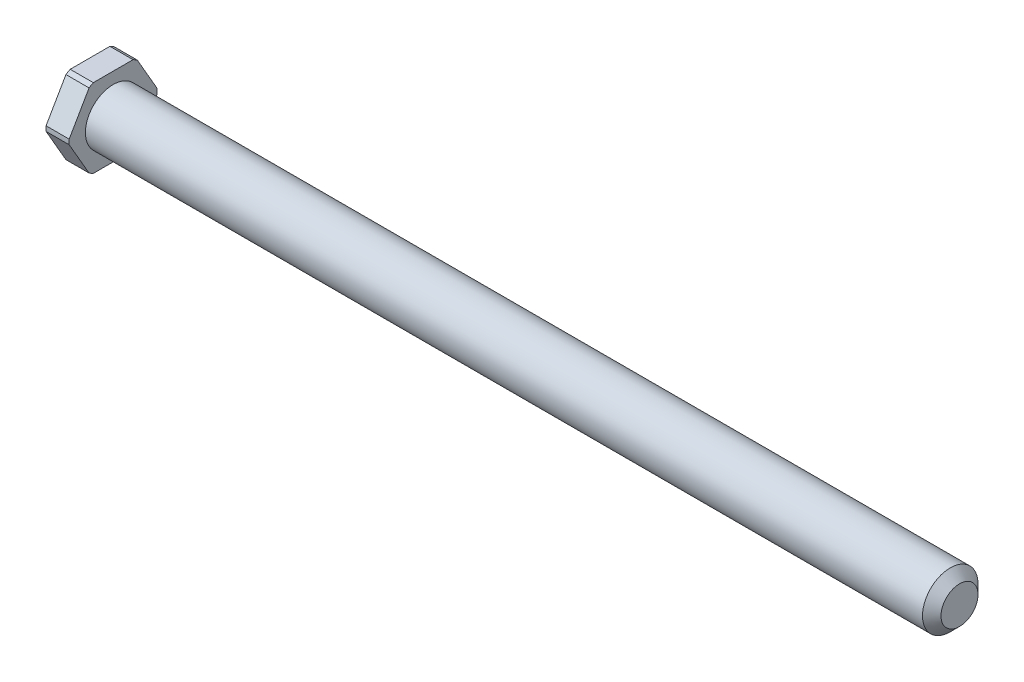
ISO-10303-21;
HEADER;
FILE_DESCRIPTION(('STEP AP214'),'2;1');
FILE_NAME('part.step','',(''),(''),'','','');
FILE_SCHEMA(('AUTOMOTIVE_DESIGN { 1 0 10303 214 1 1 1 1 }'));
ENDSEC;
DATA;
#1=APPLICATION_CONTEXT('core data for automotive mechanical design processes');
#2=APPLICATION_PROTOCOL_DEFINITION('international standard','automotive_design',2000,#1);
#3=PRODUCT_CONTEXT('',#1,'mechanical');
#4=PRODUCT('Part','Part','',(#3));
#5=PRODUCT_RELATED_PRODUCT_CATEGORY('part','',(#4));
#6=PRODUCT_DEFINITION_FORMATION('','',#4);
#7=PRODUCT_DEFINITION_CONTEXT('part definition',#1,'design');
#8=PRODUCT_DEFINITION('design','',#6,#7);
#9=PRODUCT_DEFINITION_SHAPE('','',#8);
#10=(LENGTH_UNIT() NAMED_UNIT(*) SI_UNIT(.MILLI.,.METRE.));
#11=(NAMED_UNIT(*) PLANE_ANGLE_UNIT() SI_UNIT($,.RADIAN.));
#12=(NAMED_UNIT(*) SI_UNIT($,.STERADIAN.) SOLID_ANGLE_UNIT());
#13=UNCERTAINTY_MEASURE_WITH_UNIT(LENGTH_MEASURE(1.E-05),#10,'distance_accuracy_value','');
#14=(GEOMETRIC_REPRESENTATION_CONTEXT(3) GLOBAL_UNCERTAINTY_ASSIGNED_CONTEXT((#13)) GLOBAL_UNIT_ASSIGNED_CONTEXT((#10,
#11,#12)) REPRESENTATION_CONTEXT('',''));
#15=CARTESIAN_POINT('',(0.,0.,0.));
#16=DIRECTION('',(0.,0.,1.));
#17=DIRECTION('',(1.,0.,0.));
#18=AXIS2_PLACEMENT_3D('',#15,#16,#17);
#19=CARTESIAN_POINT('',(0.,9.525,0.));
#20=DIRECTION('',(1.,0.,0.));
#21=DIRECTION('',(0.,0.,-1.));
#22=AXIS2_PLACEMENT_3D('',#19,#20,#21);
#23=PLANE('',#22);
#24=DIRECTION('',(0.,0.,-1.));
#25=VECTOR('',#24,1.);
#26=CARTESIAN_POINT('',(0.,8.5,0.));
#27=LINE('',#26,#25);
#28=CARTESIAN_POINT('',(0.,8.5,4.29832816336771));
#29=VERTEX_POINT('',#28);
#30=CARTESIAN_POINT('',(0.,8.5,-4.29832816336771));
#31=VERTEX_POINT('',#30);
#32=EDGE_CURVE('E127',#29,#31,#27,.T.);
#33=ORIENTED_EDGE('',*,*,#32,.T.);
#34=CARTESIAN_POINT('',(0.,0.,0.));
#35=DIRECTION('',(-1.,0.,0.));
#36=DIRECTION('',(0.,0.,1.));
#37=AXIS2_PLACEMENT_3D('',#34,#35,#36);
#38=CIRCLE('',#37,9.525);
#39=CARTESIAN_POINT('',(0.,7.97246138327854,-5.21205185048388));
#40=VERTEX_POINT('',#39);
#41=EDGE_CURVE('E164',#31,#40,#38,.T.);
#42=ORIENTED_EDGE('',*,*,#41,.T.);
#43=DIRECTION('',(0.,-0.866025403784439,-0.5));
#44=VECTOR('',#43,1.);
#45=CARTESIAN_POINT('',(0.,4.25,-7.36121593216773));
#46=LINE('',#45,#44);
#47=CARTESIAN_POINT('',(0.,0.527538616721467,-9.51038001385158));
#48=VERTEX_POINT('',#47);
#49=EDGE_CURVE('E189',#40,#48,#46,.T.);
#50=ORIENTED_EDGE('',*,*,#49,.T.);
#51=CARTESIAN_POINT('',(0.,-0.527538616721464,-9.51038001385158));
#52=VERTEX_POINT('',#51);
#53=EDGE_CURVE('E169',#48,#52,#38,.T.);
#54=ORIENTED_EDGE('',*,*,#53,.T.);
#55=DIRECTION('',(0.,-0.866025403784439,0.5));
#56=VECTOR('',#55,1.);
#57=CARTESIAN_POINT('',(0.,-4.25,-7.36121593216773));
#58=LINE('',#57,#56);
#59=CARTESIAN_POINT('',(0.,-7.97246138327854,-5.21205185048388));
#60=VERTEX_POINT('',#59);
#61=EDGE_CURVE('E200',#52,#60,#58,.T.);
#62=ORIENTED_EDGE('',*,*,#61,.T.);
#63=CARTESIAN_POINT('',(0.,-8.5,-4.2983281633677));
#64=VERTEX_POINT('',#63);
#65=EDGE_CURVE('E175',#60,#64,#38,.T.);
#66=ORIENTED_EDGE('',*,*,#65,.T.);
#67=DIRECTION('',(0.,0.,1.));
#68=VECTOR('',#67,1.);
#69=CARTESIAN_POINT('',(0.,-8.5,0.));
#70=LINE('',#69,#68);
#71=CARTESIAN_POINT('',(0.,-8.5,4.2983281633677));
#72=VERTEX_POINT('',#71);
#73=EDGE_CURVE('E56',#64,#72,#70,.T.);
#74=ORIENTED_EDGE('',*,*,#73,.T.);
#75=CARTESIAN_POINT('',(0.,-7.97246138327854,5.21205185048388));
#76=VERTEX_POINT('',#75);
#77=EDGE_CURVE('E172',#72,#76,#38,.T.);
#78=ORIENTED_EDGE('',*,*,#77,.T.);
#79=DIRECTION('',(0.,0.866025403784439,0.5));
#80=VECTOR('',#79,1.);
#81=CARTESIAN_POINT('',(0.,-4.25,7.36121593216773));
#82=LINE('',#81,#80);
#83=CARTESIAN_POINT('',(0.,-0.527538616721469,9.51038001385158));
#84=VERTEX_POINT('',#83);
#85=EDGE_CURVE('E48',#76,#84,#82,.T.);
#86=ORIENTED_EDGE('',*,*,#85,.T.);
#87=CARTESIAN_POINT('',(0.,0.527538616721465,9.51038001385158));
#88=VERTEX_POINT('',#87);
#89=EDGE_CURVE('E165',#84,#88,#38,.T.);
#90=ORIENTED_EDGE('',*,*,#89,.T.);
#91=DIRECTION('',(0.,0.866025403784438,-0.5));
#92=VECTOR('',#91,1.);
#93=CARTESIAN_POINT('',(0.,4.25,7.36121593216773));
#94=LINE('',#93,#92);
#95=CARTESIAN_POINT('',(0.,7.97246138327854,5.21205185048388));
#96=VERTEX_POINT('',#95);
#97=EDGE_CURVE('E181',#88,#96,#94,.T.);
#98=ORIENTED_EDGE('',*,*,#97,.T.);
#99=EDGE_CURVE('E157',#96,#29,#38,.T.);
#100=ORIENTED_EDGE('',*,*,#99,.T.);
#101=EDGE_LOOP('',(#33,#42,#50,#54,#62,#66,#74,#78,#86,#90,#98,#100));
#102=FACE_BOUND('',#101,.T.);
#103=ADVANCED_FACE('F33',(#102),#23,.F.);
#104=CARTESIAN_POINT('',(5.,9.525,0.));
#105=DIRECTION('',(-1.,0.,0.));
#106=DIRECTION('',(0.,0.,1.));
#107=AXIS2_PLACEMENT_3D('',#104,#105,#106);
#108=PLANE('',#107);
#109=CARTESIAN_POINT('',(5.,0.,0.));
#110=DIRECTION('',(-1.,0.,0.));
#111=DIRECTION('',(0.,0.,1.));
#112=AXIS2_PLACEMENT_3D('',#109,#110,#111);
#113=CIRCLE('',#112,6.);
#114=CARTESIAN_POINT('',(5.,0.,6.));
#115=VERTEX_POINT('',#114);
#116=EDGE_CURVE('E148',#115,#115,#113,.T.);
#117=ORIENTED_EDGE('',*,*,#116,.T.);
#118=EDGE_LOOP('',(#117));
#119=FACE_BOUND('',#118,.T.);
#120=DIRECTION('',(0.,0.,1.));
#121=VECTOR('',#120,1.);
#122=CARTESIAN_POINT('',(5.,8.5,0.));
#123=LINE('',#122,#121);
#124=CARTESIAN_POINT('',(5.,8.5,-4.29832816336771));
#125=VERTEX_POINT('',#124);
#126=CARTESIAN_POINT('',(5.,8.5,4.29832816336771));
#127=VERTEX_POINT('',#126);
#128=EDGE_CURVE('E124',#125,#127,#123,.T.);
#129=ORIENTED_EDGE('',*,*,#128,.T.);
#130=CARTESIAN_POINT('',(5.,0.,0.));
#131=DIRECTION('',(-1.,0.,0.));
#132=DIRECTION('',(0.,0.,1.));
#133=AXIS2_PLACEMENT_3D('',#130,#131,#132);
#134=CIRCLE('',#133,9.525);
#135=CARTESIAN_POINT('',(5.,7.97246138327854,5.21205185048388));
#136=VERTEX_POINT('',#135);
#137=EDGE_CURVE('E139',#136,#127,#134,.T.);
#138=ORIENTED_EDGE('',*,*,#137,.F.);
#139=DIRECTION('',(0.,-0.866025403784438,0.5));
#140=VECTOR('',#139,1.);
#141=CARTESIAN_POINT('',(5.,4.25,7.36121593216773));
#142=LINE('',#141,#140);
#143=CARTESIAN_POINT('',(5.,0.527538616721465,9.51038001385158));
#144=VERTEX_POINT('',#143);
#145=EDGE_CURVE('E179',#136,#144,#142,.T.);
#146=ORIENTED_EDGE('',*,*,#145,.T.);
#147=CARTESIAN_POINT('',(5.,-0.527538616721469,9.51038001385158));
#148=VERTEX_POINT('',#147);
#149=EDGE_CURVE('E150',#148,#144,#134,.T.);
#150=ORIENTED_EDGE('',*,*,#149,.F.);
#151=DIRECTION('',(0.,-0.866025403784439,-0.5));
#152=VECTOR('',#151,1.);
#153=CARTESIAN_POINT('',(5.,-4.25,7.36121593216773));
#154=LINE('',#153,#152);
#155=CARTESIAN_POINT('',(5.,-7.97246138327854,5.21205185048388));
#156=VERTEX_POINT('',#155);
#157=EDGE_CURVE('E185',#148,#156,#154,.T.);
#158=ORIENTED_EDGE('',*,*,#157,.T.);
#159=CARTESIAN_POINT('',(5.,-8.5,4.2983281633677));
#160=VERTEX_POINT('',#159);
#161=EDGE_CURVE('E156',#160,#156,#134,.T.);
#162=ORIENTED_EDGE('',*,*,#161,.F.);
#163=DIRECTION('',(0.,0.,-1.));
#164=VECTOR('',#163,1.);
#165=CARTESIAN_POINT('',(5.,-8.5,0.));
#166=LINE('',#165,#164);
#167=CARTESIAN_POINT('',(5.,-8.5,-4.2983281633677));
#168=VERTEX_POINT('',#167);
#169=EDGE_CURVE('E208',#160,#168,#166,.T.);
#170=ORIENTED_EDGE('',*,*,#169,.T.);
#171=CARTESIAN_POINT('',(5.,-7.97246138327854,-5.21205185048388));
#172=VERTEX_POINT('',#171);
#173=EDGE_CURVE('E163',#172,#168,#134,.T.);
#174=ORIENTED_EDGE('',*,*,#173,.F.);
#175=DIRECTION('',(0.,0.866025403784439,-0.5));
#176=VECTOR('',#175,1.);
#177=CARTESIAN_POINT('',(5.,-4.25,-7.36121593216773));
#178=LINE('',#177,#176);
#179=CARTESIAN_POINT('',(5.,-0.527538616721464,-9.51038001385158));
#180=VERTEX_POINT('',#179);
#181=EDGE_CURVE('E197',#172,#180,#178,.T.);
#182=ORIENTED_EDGE('',*,*,#181,.T.);
#183=CARTESIAN_POINT('',(5.,0.527538616721467,-9.51038001385158));
#184=VERTEX_POINT('',#183);
#185=EDGE_CURVE('E153',#184,#180,#134,.T.);
#186=ORIENTED_EDGE('',*,*,#185,.F.);
#187=DIRECTION('',(0.,0.866025403784439,0.5));
#188=VECTOR('',#187,1.);
#189=CARTESIAN_POINT('',(5.,4.25,-7.36121593216773));
#190=LINE('',#189,#188);
#191=CARTESIAN_POINT('',(5.,7.97246138327854,-5.21205185048388));
#192=VERTEX_POINT('',#191);
#193=EDGE_CURVE('E187',#184,#192,#190,.T.);
#194=ORIENTED_EDGE('',*,*,#193,.T.);
#195=EDGE_CURVE('E142',#125,#192,#134,.T.);
#196=ORIENTED_EDGE('',*,*,#195,.F.);
#197=EDGE_LOOP('',(#129,#138,#146,#150,#158,#162,#170,#174,#182,#186,#194,#196));
#198=FACE_BOUND('',#197,.T.);
#199=ADVANCED_FACE('F137',(#119,#198),#108,.F.);
#200=CARTESIAN_POINT('',(0.,0.,0.));
#201=DIRECTION('',(-1.,0.,0.));
#202=DIRECTION('',(0.,0.,1.));
#203=AXIS2_PLACEMENT_3D('',#200,#201,#202);
#204=CYLINDRICAL_SURFACE('',#203,9.525);
#205=DIRECTION('',(-1.,0.,0.));
#206=VECTOR('',#205,1.);
#207=CARTESIAN_POINT('',(188.001,8.5,-4.29832816336771));
#208=LINE('',#207,#206);
#209=EDGE_CURVE('E132',#125,#31,#208,.T.);
#210=ORIENTED_EDGE('',*,*,#209,.F.);
#211=ORIENTED_EDGE('',*,*,#195,.T.);
#212=DIRECTION('',(-1.,0.,0.));
#213=VECTOR('',#212,1.);
#214=CARTESIAN_POINT('',(188.001,7.97246138327854,-5.21205185048388));
#215=LINE('',#214,#213);
#216=EDGE_CURVE('E193',#192,#40,#215,.T.);
#217=ORIENTED_EDGE('',*,*,#216,.T.);
#218=ORIENTED_EDGE('',*,*,#41,.F.);
#219=EDGE_LOOP('',(#210,#211,#217,#218));
#220=FACE_BOUND('',#219,.T.);
#221=ADVANCED_FACE('F259',(#220),#204,.T.);
#222=DIRECTION('',(-1.,0.,0.));
#223=VECTOR('',#222,1.);
#224=CARTESIAN_POINT('',(188.001,8.5,4.29832816336771));
#225=LINE('',#224,#223);
#226=EDGE_CURVE('E121',#127,#29,#225,.T.);
#227=ORIENTED_EDGE('',*,*,#226,.T.);
#228=ORIENTED_EDGE('',*,*,#99,.F.);
#229=DIRECTION('',(-1.,0.,0.));
#230=VECTOR('',#229,1.);
#231=CARTESIAN_POINT('',(188.001,7.97246138327854,5.21205185048388));
#232=LINE('',#231,#230);
#233=EDGE_CURVE('E147',#136,#96,#232,.T.);
#234=ORIENTED_EDGE('',*,*,#233,.F.);
#235=ORIENTED_EDGE('',*,*,#137,.T.);
#236=EDGE_LOOP('',(#227,#228,#234,#235));
#237=FACE_BOUND('',#236,.T.);
#238=ADVANCED_FACE('F146',(#237),#204,.T.);
#239=DIRECTION('',(-1.,0.,0.));
#240=VECTOR('',#239,1.);
#241=CARTESIAN_POINT('',(188.001,0.527538616721465,9.51038001385158));
#242=LINE('',#241,#240);
#243=EDGE_CURVE('E183',#144,#88,#242,.T.);
#244=ORIENTED_EDGE('',*,*,#243,.T.);
#245=ORIENTED_EDGE('',*,*,#89,.F.);
#246=DIRECTION('',(-1.,0.,0.));
#247=VECTOR('',#246,1.);
#248=CARTESIAN_POINT('',(188.001,-0.527538616721469,9.51038001385158));
#249=LINE('',#248,#247);
#250=EDGE_CURVE('E211',#148,#84,#249,.T.);
#251=ORIENTED_EDGE('',*,*,#250,.F.);
#252=ORIENTED_EDGE('',*,*,#149,.T.);
#253=EDGE_LOOP('',(#244,#245,#251,#252));
#254=FACE_BOUND('',#253,.T.);
#255=ADVANCED_FACE('F243',(#254),#204,.T.);
#256=DIRECTION('',(-1.,0.,0.));
#257=VECTOR('',#256,1.);
#258=CARTESIAN_POINT('',(188.001,-7.97246138327854,5.21205185048388));
#259=LINE('',#258,#257);
#260=EDGE_CURVE('E219',#156,#76,#259,.T.);
#261=ORIENTED_EDGE('',*,*,#260,.T.);
#262=ORIENTED_EDGE('',*,*,#77,.F.);
#263=DIRECTION('',(-1.,0.,0.));
#264=VECTOR('',#263,1.);
#265=CARTESIAN_POINT('',(188.001,-8.5,4.2983281633677));
#266=LINE('',#265,#264);
#267=EDGE_CURVE('E201',#160,#72,#266,.T.);
#268=ORIENTED_EDGE('',*,*,#267,.F.);
#269=ORIENTED_EDGE('',*,*,#161,.T.);
#270=EDGE_LOOP('',(#261,#262,#268,#269));
#271=FACE_BOUND('',#270,.T.);
#272=ADVANCED_FACE('F222',(#271),#204,.T.);
#273=DIRECTION('',(-1.,0.,0.));
#274=VECTOR('',#273,1.);
#275=CARTESIAN_POINT('',(188.001,-8.5,-4.2983281633677));
#276=LINE('',#275,#274);
#277=EDGE_CURVE('E213',#168,#64,#276,.T.);
#278=ORIENTED_EDGE('',*,*,#277,.T.);
#279=ORIENTED_EDGE('',*,*,#65,.F.);
#280=DIRECTION('',(-1.,0.,0.));
#281=VECTOR('',#280,1.);
#282=CARTESIAN_POINT('',(188.001,-7.97246138327854,-5.21205185048388));
#283=LINE('',#282,#281);
#284=EDGE_CURVE('E190',#172,#60,#283,.T.);
#285=ORIENTED_EDGE('',*,*,#284,.F.);
#286=ORIENTED_EDGE('',*,*,#173,.T.);
#287=EDGE_LOOP('',(#278,#279,#285,#286));
#288=FACE_BOUND('',#287,.T.);
#289=ADVANCED_FACE('F240',(#288),#204,.T.);
#290=DIRECTION('',(-1.,0.,0.));
#291=VECTOR('',#290,1.);
#292=CARTESIAN_POINT('',(188.001,-0.527538616721464,-9.51038001385158));
#293=LINE('',#292,#291);
#294=EDGE_CURVE('E204',#180,#52,#293,.T.);
#295=ORIENTED_EDGE('',*,*,#294,.T.);
#296=ORIENTED_EDGE('',*,*,#53,.F.);
#297=DIRECTION('',(-1.,0.,0.));
#298=VECTOR('',#297,1.);
#299=CARTESIAN_POINT('',(188.001,0.527538616721467,-9.51038001385158));
#300=LINE('',#299,#298);
#301=EDGE_CURVE('E143',#184,#48,#300,.T.);
#302=ORIENTED_EDGE('',*,*,#301,.F.);
#303=ORIENTED_EDGE('',*,*,#185,.T.);
#304=EDGE_LOOP('',(#295,#296,#302,#303));
#305=FACE_BOUND('',#304,.T.);
#306=ADVANCED_FACE('F233',(#305),#204,.T.);
#307=CARTESIAN_POINT('',(188.,0.,0.));
#308=DIRECTION('',(-1.,0.,0.));
#309=DIRECTION('',(0.,0.,1.));
#310=AXIS2_PLACEMENT_3D('',#307,#308,#309);
#311=PLANE('',#310);
#312=CARTESIAN_POINT('',(188.,0.,0.));
#313=DIRECTION('',(-1.,0.,0.));
#314=DIRECTION('',(0.,0.,1.));
#315=AXIS2_PLACEMENT_3D('',#312,#313,#314);
#316=CIRCLE('',#315,4.00000000000003);
#317=CARTESIAN_POINT('',(188.,0.,4.00000000000003));
#318=VERTEX_POINT('',#317);
#319=EDGE_CURVE('E11',#318,#318,#316,.F.);
#320=ORIENTED_EDGE('',*,*,#319,.T.);
#321=EDGE_LOOP('',(#320));
#322=FACE_BOUND('',#321,.T.);
#323=ADVANCED_FACE('F263',(#322),#311,.F.);
#324=CARTESIAN_POINT('',(0.,0.,0.));
#325=DIRECTION('',(-1.,0.,0.));
#326=DIRECTION('',(0.,0.,1.));
#327=AXIS2_PLACEMENT_3D('',#324,#325,#326);
#328=CYLINDRICAL_SURFACE('',#327,6.);
#329=CARTESIAN_POINT('',(186.,0.,0.));
#330=DIRECTION('',(-1.,0.,0.));
#331=DIRECTION('',(0.,0.,1.));
#332=AXIS2_PLACEMENT_3D('',#329,#330,#331);
#333=CIRCLE('',#332,6.);
#334=CARTESIAN_POINT('',(186.,0.,6.));
#335=VERTEX_POINT('',#334);
#336=EDGE_CURVE('E41',#335,#335,#333,.T.);
#337=ORIENTED_EDGE('',*,*,#336,.T.);
#338=EDGE_LOOP('',(#337));
#339=FACE_BOUND('',#338,.T.);
#340=ORIENTED_EDGE('',*,*,#116,.F.);
#341=EDGE_LOOP('',(#340));
#342=FACE_BOUND('',#341,.T.);
#343=ADVANCED_FACE('F266',(#339,#342),#328,.T.);
#344=CARTESIAN_POINT('',(186.,0.,0.));
#345=DIRECTION('',(-1.,0.,0.));
#346=DIRECTION('',(0.,0.,1.));
#347=AXIS2_PLACEMENT_3D('',#344,#345,#346);
#348=CONICAL_SURFACE('',#347,6.,0.78539816339744);
#349=ORIENTED_EDGE('',*,*,#319,.F.);
#350=EDGE_LOOP('',(#349));
#351=FACE_BOUND('',#350,.T.);
#352=ORIENTED_EDGE('',*,*,#336,.F.);
#353=EDGE_LOOP('',(#352));
#354=FACE_BOUND('',#353,.T.);
#355=ADVANCED_FACE('F35',(#351,#354),#348,.T.);
#356=CARTESIAN_POINT('',(188.001,4.25,-7.36121593216773));
#357=DIRECTION('',(0.,0.5,-0.866025403784438));
#358=DIRECTION('',(0.,0.866025403784439,0.5));
#359=AXIS2_PLACEMENT_3D('',#356,#357,#358);
#360=PLANE('',#359);
#361=ORIENTED_EDGE('',*,*,#301,.T.);
#362=ORIENTED_EDGE('',*,*,#49,.F.);
#363=ORIENTED_EDGE('',*,*,#216,.F.);
#364=ORIENTED_EDGE('',*,*,#193,.F.);
#365=EDGE_LOOP('',(#361,#362,#363,#364));
#366=FACE_BOUND('',#365,.T.);
#367=ADVANCED_FACE('F277',(#366),#360,.T.);
#368=CARTESIAN_POINT('',(188.001,-4.25,-7.36121593216773));
#369=DIRECTION('',(0.,-0.5,-0.866025403784438));
#370=DIRECTION('',(0.,0.866025403784439,-0.5));
#371=AXIS2_PLACEMENT_3D('',#368,#369,#370);
#372=PLANE('',#371);
#373=ORIENTED_EDGE('',*,*,#284,.T.);
#374=ORIENTED_EDGE('',*,*,#61,.F.);
#375=ORIENTED_EDGE('',*,*,#294,.F.);
#376=ORIENTED_EDGE('',*,*,#181,.F.);
#377=EDGE_LOOP('',(#373,#374,#375,#376));
#378=FACE_BOUND('',#377,.T.);
#379=ADVANCED_FACE('F237',(#378),#372,.T.);
#380=CARTESIAN_POINT('',(188.001,-8.5,0.));
#381=DIRECTION('',(0.,-1.,0.));
#382=DIRECTION('',(0.,0.,-1.));
#383=AXIS2_PLACEMENT_3D('',#380,#381,#382);
#384=PLANE('',#383);
#385=ORIENTED_EDGE('',*,*,#267,.T.);
#386=ORIENTED_EDGE('',*,*,#73,.F.);
#387=ORIENTED_EDGE('',*,*,#277,.F.);
#388=ORIENTED_EDGE('',*,*,#169,.F.);
#389=EDGE_LOOP('',(#385,#386,#387,#388));
#390=FACE_BOUND('',#389,.T.);
#391=ADVANCED_FACE('F241',(#390),#384,.T.);
#392=CARTESIAN_POINT('',(188.001,-4.25,7.36121593216773));
#393=DIRECTION('',(0.,-0.5,0.866025403784438));
#394=DIRECTION('',(0.,-0.866025403784439,-0.5));
#395=AXIS2_PLACEMENT_3D('',#392,#393,#394);
#396=PLANE('',#395);
#397=ORIENTED_EDGE('',*,*,#250,.T.);
#398=ORIENTED_EDGE('',*,*,#85,.F.);
#399=ORIENTED_EDGE('',*,*,#260,.F.);
#400=ORIENTED_EDGE('',*,*,#157,.F.);
#401=EDGE_LOOP('',(#397,#398,#399,#400));
#402=FACE_BOUND('',#401,.T.);
#403=ADVANCED_FACE('F242',(#402),#396,.T.);
#404=CARTESIAN_POINT('',(188.001,4.25,7.36121593216773));
#405=DIRECTION('',(0.,0.5,0.866025403784438));
#406=DIRECTION('',(0.,-0.866025403784438,0.5));
#407=AXIS2_PLACEMENT_3D('',#404,#405,#406);
#408=PLANE('',#407);
#409=ORIENTED_EDGE('',*,*,#233,.T.);
#410=ORIENTED_EDGE('',*,*,#97,.F.);
#411=ORIENTED_EDGE('',*,*,#243,.F.);
#412=ORIENTED_EDGE('',*,*,#145,.F.);
#413=EDGE_LOOP('',(#409,#410,#411,#412));
#414=FACE_BOUND('',#413,.T.);
#415=ADVANCED_FACE('F245',(#414),#408,.T.);
#416=CARTESIAN_POINT('',(188.001,8.5,0.));
#417=DIRECTION('',(0.,1.,0.));
#418=DIRECTION('',(0.,0.,1.));
#419=AXIS2_PLACEMENT_3D('',#416,#417,#418);
#420=PLANE('',#419);
#421=ORIENTED_EDGE('',*,*,#209,.T.);
#422=ORIENTED_EDGE('',*,*,#32,.F.);
#423=ORIENTED_EDGE('',*,*,#226,.F.);
#424=ORIENTED_EDGE('',*,*,#128,.F.);
#425=EDGE_LOOP('',(#421,#422,#423,#424));
#426=FACE_BOUND('',#425,.T.);
#427=ADVANCED_FACE('F123',(#426),#420,.T.);
#428=CLOSED_SHELL('',(#103,#199,#221,#238,#255,#272,#289,#306,#323,#343,#355,#367,#379,#391,
#403,#415,#427));
#429=MANIFOLD_SOLID_BREP('B2',#428);
#430=ADVANCED_BREP_SHAPE_REPRESENTATION('',(#18,#429),#14);
#431=SHAPE_DEFINITION_REPRESENTATION(#9,#430);
ENDSEC;
END-ISO-10303-21;
